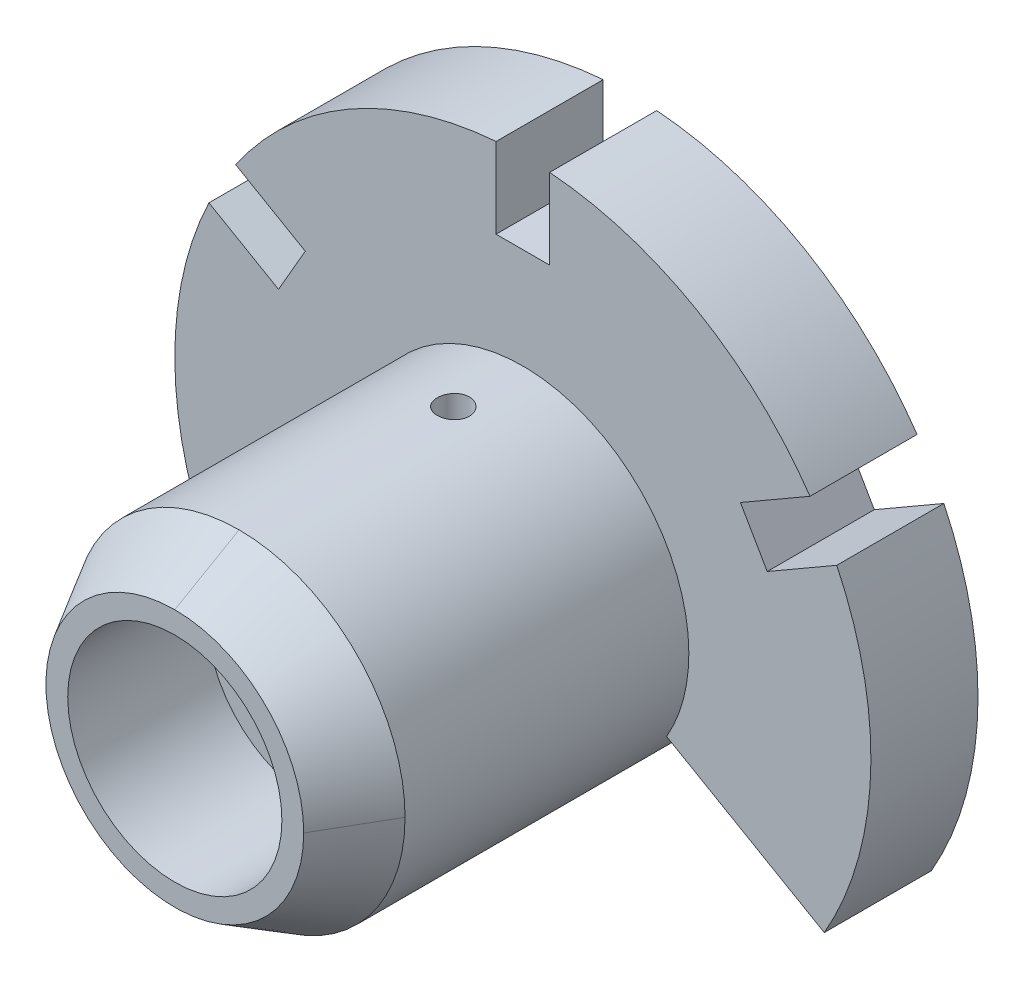
ISO-10303-21;
HEADER;
FILE_DESCRIPTION(('STEP AP214'),'2;1');
FILE_NAME('part.step','',(''),(''),'','','');
FILE_SCHEMA(('AUTOMOTIVE_DESIGN { 1 0 10303 214 1 1 1 1 }'));
ENDSEC;
DATA;
#1=APPLICATION_CONTEXT('core data for automotive mechanical design processes');
#2=APPLICATION_PROTOCOL_DEFINITION('international standard','automotive_design',2000,#1);
#3=PRODUCT_CONTEXT('',#1,'mechanical');
#4=PRODUCT('Part','Part','',(#3));
#5=PRODUCT_RELATED_PRODUCT_CATEGORY('part','',(#4));
#6=PRODUCT_DEFINITION_FORMATION('','',#4);
#7=PRODUCT_DEFINITION_CONTEXT('part definition',#1,'design');
#8=PRODUCT_DEFINITION('design','',#6,#7);
#9=PRODUCT_DEFINITION_SHAPE('','',#8);
#10=(LENGTH_UNIT() NAMED_UNIT(*) SI_UNIT(.MILLI.,.METRE.));
#11=(NAMED_UNIT(*) PLANE_ANGLE_UNIT() SI_UNIT($,.RADIAN.));
#12=(NAMED_UNIT(*) SI_UNIT($,.STERADIAN.) SOLID_ANGLE_UNIT());
#13=UNCERTAINTY_MEASURE_WITH_UNIT(LENGTH_MEASURE(1.E-05),#10,'distance_accuracy_value','');
#14=(GEOMETRIC_REPRESENTATION_CONTEXT(3) GLOBAL_UNCERTAINTY_ASSIGNED_CONTEXT((#13)) GLOBAL_UNIT_ASSIGNED_CONTEXT((#10,
#11,#12)) REPRESENTATION_CONTEXT('',''));
#15=CARTESIAN_POINT('',(0.,0.,0.));
#16=DIRECTION('',(0.,0.,1.));
#17=DIRECTION('',(1.,0.,0.));
#18=AXIS2_PLACEMENT_3D('',#15,#16,#17);
#19=CARTESIAN_POINT('',(0.,0.,0.));
#20=DIRECTION('',(0.,0.,1.));
#21=DIRECTION('',(1.,0.,0.));
#22=AXIS2_PLACEMENT_3D('',#19,#20,#21);
#23=CYLINDRICAL_SURFACE('',#22,12.5);
#24=CARTESIAN_POINT('',(0.,0.,0.));
#25=DIRECTION('',(0.,0.,1.));
#26=DIRECTION('',(1.,0.,0.));
#27=AXIS2_PLACEMENT_3D('',#24,#25,#26);
#28=CIRCLE('',#27,12.5);
#29=CARTESIAN_POINT('',(12.5,0.,0.));
#30=VERTEX_POINT('',#29);
#31=EDGE_CURVE('E200',#30,#30,#28,.T.);
#32=ORIENTED_EDGE('',*,*,#31,.F.);
#33=EDGE_LOOP('',(#32));
#34=FACE_BOUND('',#33,.T.);
#35=CARTESIAN_POINT('',(0.,0.,59.));
#36=DIRECTION('',(0.,0.,1.));
#37=DIRECTION('',(1.,0.,0.));
#38=AXIS2_PLACEMENT_3D('',#35,#36,#37);
#39=CIRCLE('',#38,12.5);
#40=CARTESIAN_POINT('',(12.5,0.,59.));
#41=VERTEX_POINT('',#40);
#42=EDGE_CURVE('E193',#41,#41,#39,.F.);
#43=ORIENTED_EDGE('',*,*,#42,.F.);
#44=EDGE_LOOP('',(#43));
#45=FACE_BOUND('',#44,.T.);
#46=CARTESIAN_POINT('',(0.,12.5,30.));
#47=CARTESIAN_POINT('',(0.165963929028716,12.4999970714968,30.0000050240773));
#48=CARTESIAN_POINT('',(0.331985420928067,12.4966615634859,30.0138184102361));
#49=CARTESIAN_POINT('',(0.659284290971381,12.4836783946933,30.0686327395954));
#50=CARTESIAN_POINT('',(0.820558683214276,12.4740268462166,30.1096504279947));
#51=CARTESIAN_POINT('',(1.13358839471402,12.4494823208195,30.2174923345044));
#52=CARTESIAN_POINT('',(1.28535442324823,12.4345953702841,30.2842868898576));
#53=CARTESIAN_POINT('',(1.57552517879763,12.4011725442513,30.4416854364459));
#54=CARTESIAN_POINT('',(1.71392971475166,12.3826366165873,30.5322897680773));
#55=CARTESIAN_POINT('',(1.97609263393972,12.3435386014785,30.7365641783755));
#56=CARTESIAN_POINT('',(2.0995595210048,12.3229472454311,30.8506027810493));
#57=CARTESIAN_POINT('',(2.32581080811943,12.2822574370147,31.0977188690646));
#58=CARTESIAN_POINT('',(2.42859304624489,12.2621590363612,31.230798342041));
#59=CARTESIAN_POINT('',(2.61189993555015,12.224437969062,31.5144458330175));
#60=CARTESIAN_POINT('',(2.69210377047565,12.2068525815312,31.6652265837589));
#61=CARTESIAN_POINT('',(2.82591582947333,12.1765733412448,31.9786198351285));
#62=CARTESIAN_POINT('',(2.87952794169564,12.1638787734309,32.1412306020232));
#63=CARTESIAN_POINT('',(2.95765058108663,12.1451184675007,32.4704765732689));
#64=CARTESIAN_POINT('',(2.98268262400617,12.1389341034343,32.6369811215255));
#65=CARTESIAN_POINT('',(3.00455808879087,12.1335389605945,32.9719323796428));
#66=CARTESIAN_POINT('',(3.00140571682399,12.1343271412568,33.1403787959569));
#67=CARTESIAN_POINT('',(2.96741912081942,12.1426811387008,33.4704759660129));
#68=CARTESIAN_POINT('',(2.93720103400494,12.1500960921292,33.6321945651896));
#69=CARTESIAN_POINT('',(2.85092141637189,12.1706283738785,33.9481973166478));
#70=CARTESIAN_POINT('',(2.79485817372027,12.1837460799133,34.1024809757344));
#71=CARTESIAN_POINT('',(2.65794121231782,12.2143476734445,34.4009129780844));
#72=CARTESIAN_POINT('',(2.5768594824696,12.2318714325758,34.5449524529167));
#73=CARTESIAN_POINT('',(2.39236688956383,12.2692875046197,34.8176045007226));
#74=CARTESIAN_POINT('',(2.28895240342647,12.2891802016137,34.9462145652851));
#75=CARTESIAN_POINT('',(2.05951493908847,12.329732025739,35.1878935703187));
#76=CARTESIAN_POINT('',(1.93297064389908,12.3503975788014,35.3004670990622));
#77=CARTESIAN_POINT('',(1.66255592459692,12.3896951594929,35.5028847197464));
#78=CARTESIAN_POINT('',(1.51868504982141,12.4083271342049,35.5927282202926));
#79=CARTESIAN_POINT('',(1.21702847718581,12.4415394956922,35.7472972206128));
#80=CARTESIAN_POINT('',(1.05920278696054,12.4561077058019,35.8119474562378));
#81=CARTESIAN_POINT('',(0.734497606078678,12.4794620474154,35.9136650790486));
#82=CARTESIAN_POINT('',(0.567619713387664,12.4882491958651,35.9507373176268));
#83=CARTESIAN_POINT('',(0.233787399651667,12.4989027542709,35.995502064652));
#84=CARTESIAN_POINT('',(0.0669284805450099,12.5009282130753,36.0038698924616));
#85=CARTESIAN_POINT('',(-0.265804381586627,12.4982807419474,35.9928332331491));
#86=CARTESIAN_POINT('',(-0.431678404764951,12.4936083648176,35.9734310380128));
#87=CARTESIAN_POINT('',(-0.755422580108845,12.4781916395217,35.9079630214836));
#88=CARTESIAN_POINT('',(-0.913370579311302,12.4675301590363,35.8622608904262));
#89=CARTESIAN_POINT('',(-1.21935330013476,12.4413335015664,35.7459018083047));
#90=CARTESIAN_POINT('',(-1.3673870666415,12.4257978558334,35.6752424570219));
#91=CARTESIAN_POINT('',(-1.6520615099557,12.3911910149582,35.5096334064022));
#92=CARTESIAN_POINT('',(-1.78847176740355,12.3720653178033,35.4142992830756));
#93=CARTESIAN_POINT('',(-2.04359904096632,12.3324936406987,35.2025430709866));
#94=CARTESIAN_POINT('',(-2.16231325074336,12.3120474520734,35.0861176439192));
#95=CARTESIAN_POINT('',(-2.38142453789941,12.2715742142771,34.8323591687915));
#96=CARTESIAN_POINT('',(-2.4813497404737,12.2515669262668,34.6946148779179));
#97=CARTESIAN_POINT('',(-2.65666020824082,12.2147538797452,34.4039095721033));
#98=CARTESIAN_POINT('',(-2.7320465722335,12.1979479778962,34.2509492389065));
#99=CARTESIAN_POINT('',(-2.85558993518171,12.1696189519335,33.934987486456));
#100=CARTESIAN_POINT('',(-2.90390754385905,12.1580647463107,33.7720517965788));
#101=CARTESIAN_POINT('',(-2.97238380283979,12.1415072663683,33.4400538149793));
#102=CARTESIAN_POINT('',(-2.99254804274991,12.1365026916888,33.2709927462382));
#103=CARTESIAN_POINT('',(-3.00387066449353,12.1337046220624,32.9363292997194));
#104=CARTESIAN_POINT('',(-2.99578106592266,12.1357241633848,32.7707535036733));
#105=CARTESIAN_POINT('',(-2.95253345626268,12.1463176460425,32.4434002357763));
#106=CARTESIAN_POINT('',(-2.91737590900097,12.1548914750658,32.2816226988887));
#107=CARTESIAN_POINT('',(-2.82138591303537,12.1775274976748,31.9672024474518));
#108=CARTESIAN_POINT('',(-2.76068402045612,12.191561756094,31.8145177274163));
#109=CARTESIAN_POINT('',(-2.61543373580583,12.2235433612686,31.5213955861163));
#110=CARTESIAN_POINT('',(-2.53088229934855,12.2414912075257,31.3809597314137));
#111=CARTESIAN_POINT('',(-2.33793007708464,12.279819325529,31.1126629998805));
#112=CARTESIAN_POINT('',(-2.22900267979018,12.3002478697533,30.9851876769013));
#113=CARTESIAN_POINT('',(-1.99143074773237,12.3409359831145,30.7500800119481));
#114=CARTESIAN_POINT('',(-1.86278158874234,12.361195511444,30.6424523367898));
#115=CARTESIAN_POINT('',(-1.5868829988014,12.3996570299581,30.4483907404453));
#116=CARTESIAN_POINT('',(-1.43936414359402,12.4178200201219,30.362331594558));
#117=CARTESIAN_POINT('',(-1.13153622828568,12.4496380610582,30.2163704672521));
#118=CARTESIAN_POINT('',(-0.971236973691224,12.4632965272855,30.1564486566084));
#119=CARTESIAN_POINT('',(-0.675887025694768,12.4824059901497,30.0739613748622));
#120=CARTESIAN_POINT('',(-0.542312066268424,12.4889599449579,30.0462833842143));
#121=CARTESIAN_POINT('',(-0.27250422747825,12.4977580149525,30.0093012191481));
#122=CARTESIAN_POINT('',(-0.136271517915777,12.5000024045682,29.9999958747745));
#123=CARTESIAN_POINT('',(0.,12.5,30.));
#124=B_SPLINE_CURVE_WITH_KNOTS('',3,(#46,#47,#48,#49,#50,#51,#52,#53,#54,#55,#56,#57,#58,#59,
#60,#61,#62,#63,#64,#65,#66,#67,#68,#69,#70,#71,#72,#73,#74,#75,#76,#77,#78,#79,#80,#81,#82,#83,
#84,#85,#86,#87,#88,#89,#90,#91,#92,#93,#94,#95,#96,#97,#98,#99,#100,#101,#102,#103,#104,#105,
#106,#107,#108,#109,#110,#111,#112,#113,#114,#115,#116,#117,#118,#119,#120,#121,#122,#123),
.UNSPECIFIED.,.T.,.F.,(4,2,2,2,2,2,2,2,2,2,2,2,2,2,2,2,2,2,2,2,2,2,2,2,2,2,2,2,2,2,2,2,2,2,2,2,
2,2,4),(0.,0.497392599366679,0.995091645758825,1.49221966408501,1.98935478998519,
2.49500570148357,3.00070943533306,3.51327262050849,4.02576083835038,4.52873995359111,
5.03164400680466,5.52338274964838,6.01515406709138,6.51154667521171,7.00801987450003,
7.51749958381935,8.02699254752171,8.53799614678203,9.04890983140415,9.54771776810826,
10.0464845383097,10.5385143736981,11.0305915421211,11.5308523313794,12.031192370573,
12.5427824523192,13.0543496229378,13.5628484119093,14.0712462285018,14.5662165454702,
15.0611783809799,15.5536406351284,16.0461657803879,16.5505844610431,17.0551215958269,
17.5678974206352,18.0802835459069,18.4887142303991,18.897118905514),.UNSPECIFIED.);
#125=CARTESIAN_POINT('',(0.,12.5,30.));
#126=VERTEX_POINT('',#125);
#127=EDGE_CURVE('E380',#126,#126,#124,.T.);
#128=ORIENTED_EDGE('',*,*,#127,.F.);
#129=EDGE_LOOP('',(#128));
#130=FACE_BOUND('',#129,.T.);
#131=ADVANCED_FACE('F41',(#34,#45,#130),#23,.F.);
#132=CARTESIAN_POINT('',(0.,0.,0.));
#133=DIRECTION('',(0.,0.,1.));
#134=DIRECTION('',(1.,0.,0.));
#135=AXIS2_PLACEMENT_3D('',#132,#133,#134);
#136=CYLINDRICAL_SURFACE('',#135,31.);
#137=CARTESIAN_POINT('',(0.,0.,73.));
#138=DIRECTION('',(0.,0.,-1.));
#139=DIRECTION('',(1.,0.,0.));
#140=AXIS2_PLACEMENT_3D('',#137,#138,#139);
#141=CIRCLE('',#140,31.);
#142=CARTESIAN_POINT('',(31.,0.,73.));
#143=VERTEX_POINT('',#142);
#144=CARTESIAN_POINT('',(0.,31.,73.));
#145=VERTEX_POINT('',#144);
#146=EDGE_CURVE('E170',#143,#145,#141,.T.);
#147=ORIENTED_EDGE('',*,*,#146,.T.);
#148=CARTESIAN_POINT('',(0.,0.,73.));
#149=DIRECTION('',(0.,0.,-1.));
#150=DIRECTION('',(0.,1.,0.));
#151=AXIS2_PLACEMENT_3D('',#148,#149,#150);
#152=CIRCLE('',#151,31.);
#153=EDGE_CURVE('E180',#145,#143,#152,.T.);
#154=ORIENTED_EDGE('',*,*,#153,.T.);
#155=EDGE_LOOP('',(#147,#154));
#156=FACE_BOUND('',#155,.T.);
#157=DIRECTION('',(0.,0.,1.));
#158=VECTOR('',#157,1.);
#159=CARTESIAN_POINT('',(26.8467875173176,-15.4999999999999,0.));
#160=LINE('',#159,#158);
#161=CARTESIAN_POINT('',(26.8467875173176,-15.4999999999999,20.));
#162=VERTEX_POINT('',#161);
#163=CARTESIAN_POINT('',(26.8467875173176,-15.4999999999999,0.));
#164=VERTEX_POINT('',#163);
#165=EDGE_CURVE('E214',#162,#164,#160,.F.);
#166=ORIENTED_EDGE('',*,*,#165,.F.);
#167=CARTESIAN_POINT('',(0.,0.,20.));
#168=DIRECTION('',(0.,0.,1.));
#169=DIRECTION('',(1.,0.,0.));
#170=AXIS2_PLACEMENT_3D('',#167,#168,#169);
#171=CIRCLE('',#170,31.);
#172=CARTESIAN_POINT('',(-26.8467875173176,-15.4999999999999,20.));
#173=VERTEX_POINT('',#172);
#174=EDGE_CURVE('E208',#162,#173,#171,.T.);
#175=ORIENTED_EDGE('',*,*,#174,.T.);
#176=DIRECTION('',(0.,0.,1.));
#177=VECTOR('',#176,1.);
#178=CARTESIAN_POINT('',(-26.8467875173176,-15.4999999999999,0.));
#179=LINE('',#178,#177);
#180=CARTESIAN_POINT('',(-26.8467875173176,-15.4999999999999,0.));
#181=VERTEX_POINT('',#180);
#182=EDGE_CURVE('E211',#173,#181,#179,.F.);
#183=ORIENTED_EDGE('',*,*,#182,.T.);
#184=CARTESIAN_POINT('',(0.,0.,0.));
#185=DIRECTION('',(0.,0.,1.));
#186=DIRECTION('',(1.,0.,0.));
#187=AXIS2_PLACEMENT_3D('',#184,#185,#186);
#188=CIRCLE('',#187,31.);
#189=EDGE_CURVE('E205',#181,#164,#188,.T.);
#190=ORIENTED_EDGE('',*,*,#189,.T.);
#191=EDGE_LOOP('',(#166,#175,#183,#190));
#192=FACE_BOUND('',#191,.T.);
#193=CARTESIAN_POINT('',(0.,31.,30.));
#194=CARTESIAN_POINT('',(0.16808953819396,30.9999981216868,30.0000072926713));
#195=CARTESIAN_POINT('',(0.336290893639732,30.9986183296534,30.0141746003681));
#196=CARTESIAN_POINT('',(0.668032360014184,30.9932467413095,30.0704779963018));
#197=CARTESIAN_POINT('',(0.831567095634698,30.9892520504391,30.1126450796107));
#198=CARTESIAN_POINT('',(1.1491232015134,30.9791016952434,30.223710689862));
#199=CARTESIAN_POINT('',(1.3031501789756,30.9729473191915,30.2925932833118));
#200=CARTESIAN_POINT('',(1.59742179410561,30.9591661779027,30.4551041523002));
#201=CARTESIAN_POINT('',(1.73766920753563,30.951539710126,30.5487274299855));
#202=CARTESIAN_POINT('',(2.00090903838761,30.9356401661369,30.7584021324513));
#203=CARTESIAN_POINT('',(2.12384834831157,30.9273652160721,30.8745200960667));
#204=CARTESIAN_POINT('',(2.34852587257413,30.9111168874028,31.1257463092444));
#205=CARTESIAN_POINT('',(2.4502631167817,30.9031435226114,31.2608554273009));
#206=CARTESIAN_POINT('',(2.62983510424632,30.8883818042451,31.5465590733066));
#207=CARTESIAN_POINT('',(2.70762204927907,30.8815958318763,31.697183777231));
#208=CARTESIAN_POINT('',(2.83678012663747,30.8700001357254,32.0094334566859));
#209=CARTESIAN_POINT('',(2.88815187276075,30.8651903660238,32.1710581765154));
#210=CARTESIAN_POINT('',(2.96286448602835,30.8581083751264,32.5001800490751));
#211=CARTESIAN_POINT('',(2.98629315240275,30.8558282073194,32.6676570970113));
#212=CARTESIAN_POINT('',(3.004725922064,30.8540388359978,33.0041806726224));
#213=CARTESIAN_POINT('',(2.99973072800294,30.8545295639853,33.1732271613968));
#214=CARTESIAN_POINT('',(2.96152997789402,30.8582192879785,33.5074865186794));
#215=CARTESIAN_POINT('',(2.92842019384616,30.8614090894947,33.6727104482114));
#216=CARTESIAN_POINT('',(2.83507910089501,30.8701231766115,33.9952451505818));
#217=CARTESIAN_POINT('',(2.7748474465782,30.8756474919435,34.1525558226117));
#218=CARTESIAN_POINT('',(2.62886634023895,30.8884187378213,34.4551016302242));
#219=CARTESIAN_POINT('',(2.54307429832064,30.895668539364,34.6003160896787));
#220=CARTESIAN_POINT('',(2.34843836166378,30.9110714160826,34.8743211427964));
#221=CARTESIAN_POINT('',(2.23959383532138,30.9192245160047,35.0031112863028));
#222=CARTESIAN_POINT('',(2.00140724966772,30.9355562996981,35.2411684252305));
#223=CARTESIAN_POINT('',(1.87198246168808,30.9437349502123,35.3503526663892));
#224=CARTESIAN_POINT('',(1.59659679423303,30.9591644807365,35.5454575776251));
#225=CARTESIAN_POINT('',(1.4506358979559,30.9664153598039,35.6313782240647));
#226=CARTESIAN_POINT('',(1.14626470800904,30.9791745335425,35.777513274488));
#227=CARTESIAN_POINT('',(0.987852439296271,30.984682551061,35.8377235905031));
#228=CARTESIAN_POINT('',(0.663101793767337,30.9933325036748,35.9306687436254));
#229=CARTESIAN_POINT('',(0.496763639032332,30.9964745050237,35.9634043500886));
#230=CARTESIAN_POINT('',(0.161599739931645,31.0000298977498,36.0003661115517));
#231=CARTESIAN_POINT('',(-0.00721329744838298,31.0004542206361,36.0047064842122));
#232=CARTESIAN_POINT('',(-0.34316444686552,30.9985557346558,35.9850543988535));
#233=CARTESIAN_POINT('',(-0.510302580043938,30.9962329605082,35.9610622989136));
#234=CARTESIAN_POINT('',(-0.837830646880853,30.9891083456253,35.885521054054));
#235=CARTESIAN_POINT('',(-0.998233002571721,30.9843113065313,35.834025276846));
#236=CARTESIAN_POINT('',(-1.30812213033292,30.9727764720913,35.7049932283578));
#237=CARTESIAN_POINT('',(-1.45760867236246,30.9660386358595,35.6274564084791));
#238=CARTESIAN_POINT('',(-1.7419399139047,30.9513489804652,35.4482592182569));
#239=CARTESIAN_POINT('',(-1.87673703972383,30.9433934064725,35.3465236756985));
#240=CARTESIAN_POINT('',(-2.12738176682207,30.9271733648177,35.1219248898692));
#241=CARTESIAN_POINT('',(-2.24322892299976,30.9189088899057,34.9990611504731));
#242=CARTESIAN_POINT('',(-2.45308082086947,30.9029697222484,34.7351958174356));
#243=CARTESIAN_POINT('',(-2.54701068944993,30.8952971094589,34.5941345339742));
#244=CARTESIAN_POINT('',(-2.70984725368369,30.8814415920736,34.2981732929595));
#245=CARTESIAN_POINT('',(-2.77875427265655,30.8752586682299,34.1432735142454));
#246=CARTESIAN_POINT('',(-2.88946331848758,30.8650953093356,33.824290822766));
#247=CARTESIAN_POINT('',(-2.93131016097981,30.8611112342798,33.6602235848962));
#248=CARTESIAN_POINT('',(-2.98685649184875,30.8557851841355,33.3273509537787));
#249=CARTESIAN_POINT('',(-3.00055673174161,30.8544431385049,33.1585456871586));
#250=CARTESIAN_POINT('',(-2.99941089677632,30.8545544912674,32.8217329177514));
#251=CARTESIAN_POINT('',(-2.98468244202973,30.8559963715282,32.6537249986032));
#252=CARTESIAN_POINT('',(-2.92734363942155,30.8614885711948,32.3225818773394));
#253=CARTESIAN_POINT('',(-2.88473325762495,30.8655388937753,32.1594466811547));
#254=CARTESIAN_POINT('',(-2.77287207296849,30.8757884480354,31.8426789676018));
#255=CARTESIAN_POINT('',(-2.70362445425821,30.8819874228617,31.6890453169893));
#256=CARTESIAN_POINT('',(-2.5404667821681,30.8958363260255,31.3955632677754));
#257=CARTESIAN_POINT('',(-2.44655691826962,30.9034862432152,31.2557147632734));
#258=CARTESIAN_POINT('',(-2.23629854709217,30.9194129497018,30.9931700503403));
#259=CARTESIAN_POINT('',(-2.11986246702146,30.9276921063672,30.8705441166544));
#260=CARTESIAN_POINT('',(-1.86802794095432,30.9439227915658,30.6465182199721));
#261=CARTESIAN_POINT('',(-1.7326249503521,30.9518742409853,30.54512335866));
#262=CARTESIAN_POINT('',(-1.44635100828488,30.9665730255592,30.3662508870881));
#263=CARTESIAN_POINT('',(-1.29544401960985,30.9733174506824,30.2888307584908));
#264=CARTESIAN_POINT('',(-0.982804571537972,30.984810213023,30.1605311283933));
#265=CARTESIAN_POINT('',(-0.821084602869863,30.9895608087819,30.1096215807844));
#266=CARTESIAN_POINT('',(-0.548700807348903,30.9953315866936,30.0485391227234));
#267=CARTESIAN_POINT('',(-0.439780465789539,30.9970741185407,30.030361680573));
#268=CARTESIAN_POINT('',(-0.220589467546875,30.9994089393846,30.0060897490584));
#269=CARTESIAN_POINT('',(-0.110318815999825,31.0000012327554,29.9999952137481));
#270=CARTESIAN_POINT('',(0.,31.,30.));
#271=B_SPLINE_CURVE_WITH_KNOTS('',3,(#193,#194,#195,#196,#197,#198,#199,#200,#201,#202,#203,
#204,#205,#206,#207,#208,#209,#210,#211,#212,#213,#214,#215,#216,#217,#218,#219,#220,#221,#222,
#223,#224,#225,#226,#227,#228,#229,#230,#231,#232,#233,#234,#235,#236,#237,#238,#239,#240,#241,
#242,#243,#244,#245,#246,#247,#248,#249,#250,#251,#252,#253,#254,#255,#256,#257,#258,#259,#260,
#261,#262,#263,#264,#265,#266,#267,#268,#269,#270),.UNSPECIFIED.,.T.,.F.,(4,2,2,2,2,2,2,2,2,2,2,
2,2,2,2,2,2,2,2,2,2,2,2,2,2,2,2,2,2,2,2,2,2,2,2,2,2,2,4),(0.,0.503865783837313,1.00829026678701,
1.51241436562501,2.01643670435002,2.5219733460598,3.02753311424981,3.53409539715722,
4.04064590878196,4.54560057243948,5.0505427534186,5.55377172395107,6.05700710359209,
6.56108573191771,7.06517817303649,7.57135072598204,8.07752379323573,8.58377731257894,
9.09001665516903,9.59421843000421,10.0984138325665,10.6016344376436,11.1048656445763,
11.6096810161169,12.1145082431801,12.6210355890123,13.1275563897857,13.6332361544347,
14.1389024172251,14.6424810339147,15.1460602635093,15.6495793151824,16.153094498405,
16.6586079749665,17.164242783978,17.671080677736,18.1773428831038,18.5080362068125,
18.838728273035),.UNSPECIFIED.);
#272=CARTESIAN_POINT('',(0.,31.,30.));
#273=VERTEX_POINT('',#272);
#274=EDGE_CURVE('E45',#273,#273,#271,.T.);
#275=ORIENTED_EDGE('',*,*,#274,.T.);
#276=EDGE_LOOP('',(#275));
#277=FACE_BOUND('',#276,.T.);
#278=ADVANCED_FACE('F186',(#156,#192,#277),#136,.T.);
#279=CARTESIAN_POINT('',(0.,0.,20.));
#280=DIRECTION('',(0.499999999999998,0.86602540378444,0.));
#281=DIRECTION('',(-0.86602540378444,0.499999999999998,0.));
#282=AXIS2_PLACEMENT_3D('',#279,#280,#281);
#283=PLANE('',#282);
#284=DIRECTION('',(0.86602540378444,-0.499999999999998,0.));
#285=VECTOR('',#284,1.);
#286=CARTESIAN_POINT('',(0.,0.,20.));
#287=LINE('',#286,#285);
#288=CARTESIAN_POINT('',(56.2916512459883,-32.4999999999997,20.));
#289=VERTEX_POINT('',#288);
#290=EDGE_CURVE('E219',#162,#289,#287,.T.);
#291=ORIENTED_EDGE('',*,*,#290,.F.);
#292=ORIENTED_EDGE('',*,*,#165,.T.);
#293=DIRECTION('',(0.86602540378444,-0.499999999999998,0.));
#294=VECTOR('',#293,1.);
#295=CARTESIAN_POINT('',(0.,0.,0.));
#296=LINE('',#295,#294);
#297=CARTESIAN_POINT('',(56.2916512459883,-32.4999999999997,0.));
#298=VERTEX_POINT('',#297);
#299=EDGE_CURVE('E218',#164,#298,#296,.T.);
#300=ORIENTED_EDGE('',*,*,#299,.T.);
#301=DIRECTION('',(0.,0.,-1.));
#302=VECTOR('',#301,1.);
#303=CARTESIAN_POINT('',(56.2916512459883,-32.4999999999997,20.));
#304=LINE('',#303,#302);
#305=EDGE_CURVE('E11',#289,#298,#304,.T.);
#306=ORIENTED_EDGE('',*,*,#305,.F.);
#307=EDGE_LOOP('',(#291,#292,#300,#306));
#308=FACE_BOUND('',#307,.T.);
#309=ADVANCED_FACE('F43',(#308),#283,.F.);
#310=CARTESIAN_POINT('',(0.,0.,20.));
#311=DIRECTION('',(0.,0.,-1.));
#312=DIRECTION('',(-1.,0.,0.));
#313=AXIS2_PLACEMENT_3D('',#310,#311,#312);
#314=CYLINDRICAL_SURFACE('',#313,64.9999999999998);
#315=CARTESIAN_POINT('',(0.,0.,0.));
#316=DIRECTION('',(0.,0.,1.));
#317=DIRECTION('',(1.,0.,0.));
#318=AXIS2_PLACEMENT_3D('',#315,#316,#317);
#319=CIRCLE('',#318,64.9999999999998);
#320=CARTESIAN_POINT('',(58.6248608016092,28.073576473117,0.));
#321=VERTEX_POINT('',#320);
#322=EDGE_CURVE('E278',#298,#321,#319,.T.);
#323=ORIENTED_EDGE('',*,*,#322,.T.);
#324=DIRECTION('',(0.,0.,-1.));
#325=VECTOR('',#324,1.);
#326=CARTESIAN_POINT('',(58.6248608016092,28.073576473117,20.));
#327=LINE('',#326,#325);
#328=CARTESIAN_POINT('',(58.6248608016092,28.073576473117,20.));
#329=VERTEX_POINT('',#328);
#330=EDGE_CURVE('E56',#329,#321,#327,.T.);
#331=ORIENTED_EDGE('',*,*,#330,.F.);
#332=CARTESIAN_POINT('',(0.,0.,20.));
#333=DIRECTION('',(0.,0.,1.));
#334=DIRECTION('',(1.,0.,0.));
#335=AXIS2_PLACEMENT_3D('',#332,#333,#334);
#336=CIRCLE('',#335,64.9999999999998);
#337=EDGE_CURVE('E222',#289,#329,#336,.T.);
#338=ORIENTED_EDGE('',*,*,#337,.F.);
#339=ORIENTED_EDGE('',*,*,#305,.T.);
#340=EDGE_LOOP('',(#323,#331,#338,#339));
#341=FACE_BOUND('',#340,.T.);
#342=ADVANCED_FACE('F432',(#341),#314,.T.);
#343=CARTESIAN_POINT('',(2.49999999999999,-4.3301270189222,20.));
#344=DIRECTION('',(-0.499999999999998,0.86602540378444,0.));
#345=DIRECTION('',(-0.86602540378444,-0.499999999999998,0.));
#346=AXIS2_PLACEMENT_3D('',#343,#344,#345);
#347=PLANE('',#346);
#348=DIRECTION('',(0.86602540378444,0.499999999999998,0.));
#349=VECTOR('',#348,1.);
#350=CARTESIAN_POINT('',(2.49999999999999,-4.3301270189222,0.));
#351=LINE('',#350,#349);
#352=CARTESIAN_POINT('',(45.6344797448426,20.573576473117,0.));
#353=VERTEX_POINT('',#352);
#354=EDGE_CURVE('E282',#353,#321,#351,.T.);
#355=ORIENTED_EDGE('',*,*,#354,.F.);
#356=DIRECTION('',(0.,0.,-1.));
#357=VECTOR('',#356,1.);
#358=CARTESIAN_POINT('',(45.6344797448426,20.573576473117,20.));
#359=LINE('',#358,#357);
#360=CARTESIAN_POINT('',(45.6344797448426,20.573576473117,20.));
#361=VERTEX_POINT('',#360);
#362=EDGE_CURVE('E365',#361,#353,#359,.T.);
#363=ORIENTED_EDGE('',*,*,#362,.F.);
#364=DIRECTION('',(0.86602540378444,0.499999999999998,0.));
#365=VECTOR('',#364,1.);
#366=CARTESIAN_POINT('',(2.49999999999999,-4.3301270189222,20.));
#367=LINE('',#366,#365);
#368=EDGE_CURVE('E226',#361,#329,#367,.T.);
#369=ORIENTED_EDGE('',*,*,#368,.T.);
#370=ORIENTED_EDGE('',*,*,#330,.T.);
#371=EDGE_LOOP('',(#355,#363,#369,#370));
#372=FACE_BOUND('',#371,.T.);
#373=ADVANCED_FACE('F486',(#372),#347,.T.);
#374=CARTESIAN_POINT('',(43.1344797448426,24.9037034920392,20.));
#375=DIRECTION('',(0.86602540378444,0.499999999999998,0.));
#376=DIRECTION('',(-0.499999999999998,0.86602540378444,0.));
#377=AXIS2_PLACEMENT_3D('',#374,#375,#376);
#378=PLANE('',#377);
#379=DIRECTION('',(0.499999999999998,-0.86602540378444,0.));
#380=VECTOR('',#379,1.);
#381=CARTESIAN_POINT('',(43.1344797448426,24.9037034920392,0.));
#382=LINE('',#381,#380);
#383=CARTESIAN_POINT('',(40.6344797448426,29.2338305109614,0.));
#384=VERTEX_POINT('',#383);
#385=EDGE_CURVE('E286',#384,#353,#382,.T.);
#386=ORIENTED_EDGE('',*,*,#385,.F.);
#387=DIRECTION('',(0.,0.,-1.));
#388=VECTOR('',#387,1.);
#389=CARTESIAN_POINT('',(40.6344797448426,29.2338305109614,20.));
#390=LINE('',#389,#388);
#391=CARTESIAN_POINT('',(40.6344797448426,29.2338305109614,20.));
#392=VERTEX_POINT('',#391);
#393=EDGE_CURVE('E362',#392,#384,#390,.T.);
#394=ORIENTED_EDGE('',*,*,#393,.F.);
#395=DIRECTION('',(0.499999999999998,-0.86602540378444,0.));
#396=VECTOR('',#395,1.);
#397=CARTESIAN_POINT('',(43.1344797448426,24.9037034920392,20.));
#398=LINE('',#397,#396);
#399=EDGE_CURVE('E230',#392,#361,#398,.T.);
#400=ORIENTED_EDGE('',*,*,#399,.T.);
#401=ORIENTED_EDGE('',*,*,#362,.T.);
#402=EDGE_LOOP('',(#386,#394,#400,#401));
#403=FACE_BOUND('',#402,.T.);
#404=ADVANCED_FACE('F482',(#403),#378,.T.);
#405=CARTESIAN_POINT('',(-2.49999999999998,4.33012701892218,20.));
#406=DIRECTION('',(0.499999999999998,-0.86602540378444,0.));
#407=DIRECTION('',(0.86602540378444,0.499999999999998,0.));
#408=AXIS2_PLACEMENT_3D('',#405,#406,#407);
#409=PLANE('',#408);
#410=DIRECTION('',(-0.86602540378444,-0.499999999999998,0.));
#411=VECTOR('',#410,1.);
#412=CARTESIAN_POINT('',(-2.49999999999998,4.33012701892218,0.));
#413=LINE('',#412,#411);
#414=CARTESIAN_POINT('',(53.6248608016092,36.7338305109614,0.));
#415=VERTEX_POINT('',#414);
#416=EDGE_CURVE('E290',#415,#384,#413,.T.);
#417=ORIENTED_EDGE('',*,*,#416,.F.);
#418=DIRECTION('',(0.,0.,-1.));
#419=VECTOR('',#418,1.);
#420=CARTESIAN_POINT('',(53.6248608016092,36.7338305109614,20.));
#421=LINE('',#420,#419);
#422=CARTESIAN_POINT('',(53.6248608016092,36.7338305109614,20.));
#423=VERTEX_POINT('',#422);
#424=EDGE_CURVE('E359',#423,#415,#421,.T.);
#425=ORIENTED_EDGE('',*,*,#424,.F.);
#426=DIRECTION('',(-0.86602540378444,-0.499999999999998,0.));
#427=VECTOR('',#426,1.);
#428=CARTESIAN_POINT('',(-2.49999999999998,4.33012701892218,20.));
#429=LINE('',#428,#427);
#430=EDGE_CURVE('E234',#423,#392,#429,.T.);
#431=ORIENTED_EDGE('',*,*,#430,.T.);
#432=ORIENTED_EDGE('',*,*,#393,.T.);
#433=EDGE_LOOP('',(#417,#425,#431,#432));
#434=FACE_BOUND('',#433,.T.);
#435=ADVANCED_FACE('F478',(#434),#409,.T.);
#436=CARTESIAN_POINT('',(0.,0.,20.));
#437=DIRECTION('',(0.,0.,-1.));
#438=DIRECTION('',(-1.,0.,0.));
#439=AXIS2_PLACEMENT_3D('',#436,#437,#438);
#440=CYLINDRICAL_SURFACE('',#439,65.);
#441=CARTESIAN_POINT('',(0.,0.,0.));
#442=DIRECTION('',(0.,0.,1.));
#443=DIRECTION('',(1.,0.,0.));
#444=AXIS2_PLACEMENT_3D('',#441,#442,#443);
#445=CIRCLE('',#444,65.);
#446=CARTESIAN_POINT('',(5.,64.8074069840786,0.));
#447=VERTEX_POINT('',#446);
#448=EDGE_CURVE('E294',#415,#447,#445,.T.);
#449=ORIENTED_EDGE('',*,*,#448,.T.);
#450=DIRECTION('',(0.,0.,-1.));
#451=VECTOR('',#450,1.);
#452=CARTESIAN_POINT('',(5.,64.8074069840786,20.));
#453=LINE('',#452,#451);
#454=CARTESIAN_POINT('',(5.,64.8074069840786,20.));
#455=VERTEX_POINT('',#454);
#456=EDGE_CURVE('E356',#455,#447,#453,.T.);
#457=ORIENTED_EDGE('',*,*,#456,.F.);
#458=CARTESIAN_POINT('',(0.,0.,20.));
#459=DIRECTION('',(0.,0.,1.));
#460=DIRECTION('',(1.,0.,0.));
#461=AXIS2_PLACEMENT_3D('',#458,#459,#460);
#462=CIRCLE('',#461,65.);
#463=EDGE_CURVE('E238',#423,#455,#462,.T.);
#464=ORIENTED_EDGE('',*,*,#463,.F.);
#465=ORIENTED_EDGE('',*,*,#424,.T.);
#466=EDGE_LOOP('',(#449,#457,#464,#465));
#467=FACE_BOUND('',#466,.T.);
#468=ADVANCED_FACE('F474',(#467),#440,.T.);
#469=CARTESIAN_POINT('',(5.00000000000001,0.,20.));
#470=DIRECTION('',(-1.,0.,0.));
#471=DIRECTION('',(0.,-1.,0.));
#472=AXIS2_PLACEMENT_3D('',#469,#470,#471);
#473=PLANE('',#472);
#474=DIRECTION('',(0.,1.,0.));
#475=VECTOR('',#474,1.);
#476=CARTESIAN_POINT('',(5.00000000000001,0.,0.));
#477=LINE('',#476,#475);
#478=CARTESIAN_POINT('',(5.,49.8074069840786,0.));
#479=VERTEX_POINT('',#478);
#480=EDGE_CURVE('E298',#479,#447,#477,.T.);
#481=ORIENTED_EDGE('',*,*,#480,.F.);
#482=DIRECTION('',(0.,0.,-1.));
#483=VECTOR('',#482,1.);
#484=CARTESIAN_POINT('',(5.,49.8074069840786,20.));
#485=LINE('',#484,#483);
#486=CARTESIAN_POINT('',(5.,49.8074069840786,20.));
#487=VERTEX_POINT('',#486);
#488=EDGE_CURVE('E353',#487,#479,#485,.T.);
#489=ORIENTED_EDGE('',*,*,#488,.F.);
#490=DIRECTION('',(0.,1.,0.));
#491=VECTOR('',#490,1.);
#492=CARTESIAN_POINT('',(5.00000000000001,0.,20.));
#493=LINE('',#492,#491);
#494=EDGE_CURVE('E241',#487,#455,#493,.T.);
#495=ORIENTED_EDGE('',*,*,#494,.T.);
#496=ORIENTED_EDGE('',*,*,#456,.T.);
#497=EDGE_LOOP('',(#481,#489,#495,#496));
#498=FACE_BOUND('',#497,.T.);
#499=ADVANCED_FACE('F470',(#498),#473,.T.);
#500=CARTESIAN_POINT('',(0.,49.8074069840786,20.));
#501=DIRECTION('',(0.,1.,0.));
#502=DIRECTION('',(0.,0.,1.));
#503=AXIS2_PLACEMENT_3D('',#500,#501,#502);
#504=PLANE('',#503);
#505=DIRECTION('',(1.,0.,0.));
#506=VECTOR('',#505,1.);
#507=CARTESIAN_POINT('',(0.,49.8074069840786,0.));
#508=LINE('',#507,#506);
#509=CARTESIAN_POINT('',(-5.,49.8074069840786,0.));
#510=VERTEX_POINT('',#509);
#511=EDGE_CURVE('E302',#510,#479,#508,.T.);
#512=ORIENTED_EDGE('',*,*,#511,.F.);
#513=DIRECTION('',(0.,0.,-1.));
#514=VECTOR('',#513,1.);
#515=CARTESIAN_POINT('',(-5.,49.8074069840786,20.));
#516=LINE('',#515,#514);
#517=CARTESIAN_POINT('',(-5.,49.8074069840786,20.));
#518=VERTEX_POINT('',#517);
#519=EDGE_CURVE('E350',#518,#510,#516,.T.);
#520=ORIENTED_EDGE('',*,*,#519,.F.);
#521=DIRECTION('',(1.,0.,0.));
#522=VECTOR('',#521,1.);
#523=CARTESIAN_POINT('',(0.,49.8074069840786,20.));
#524=LINE('',#523,#522);
#525=EDGE_CURVE('E245',#518,#487,#524,.T.);
#526=ORIENTED_EDGE('',*,*,#525,.T.);
#527=ORIENTED_EDGE('',*,*,#488,.T.);
#528=EDGE_LOOP('',(#512,#520,#526,#527));
#529=FACE_BOUND('',#528,.T.);
#530=ADVANCED_FACE('F466',(#529),#504,.T.);
#531=CARTESIAN_POINT('',(-4.99999999999999,0.,20.));
#532=DIRECTION('',(1.,0.,0.));
#533=DIRECTION('',(0.,1.,0.));
#534=AXIS2_PLACEMENT_3D('',#531,#532,#533);
#535=PLANE('',#534);
#536=DIRECTION('',(0.,-1.,0.));
#537=VECTOR('',#536,1.);
#538=CARTESIAN_POINT('',(-4.99999999999999,0.,0.));
#539=LINE('',#538,#537);
#540=CARTESIAN_POINT('',(-5.,64.8074069840786,0.));
#541=VERTEX_POINT('',#540);
#542=EDGE_CURVE('E306',#541,#510,#539,.T.);
#543=ORIENTED_EDGE('',*,*,#542,.F.);
#544=DIRECTION('',(0.,0.,-1.));
#545=VECTOR('',#544,1.);
#546=CARTESIAN_POINT('',(-5.,64.8074069840786,20.));
#547=LINE('',#546,#545);
#548=CARTESIAN_POINT('',(-5.,64.8074069840786,20.));
#549=VERTEX_POINT('',#548);
#550=EDGE_CURVE('E347',#549,#541,#547,.T.);
#551=ORIENTED_EDGE('',*,*,#550,.F.);
#552=DIRECTION('',(0.,-1.,0.));
#553=VECTOR('',#552,1.);
#554=CARTESIAN_POINT('',(-4.99999999999999,0.,20.));
#555=LINE('',#554,#553);
#556=EDGE_CURVE('E249',#549,#518,#555,.T.);
#557=ORIENTED_EDGE('',*,*,#556,.T.);
#558=ORIENTED_EDGE('',*,*,#519,.T.);
#559=EDGE_LOOP('',(#543,#551,#557,#558));
#560=FACE_BOUND('',#559,.T.);
#561=ADVANCED_FACE('F462',(#560),#535,.T.);
#562=CARTESIAN_POINT('',(0.,0.,20.));
#563=DIRECTION('',(0.,0.,-1.));
#564=DIRECTION('',(-1.,0.,0.));
#565=AXIS2_PLACEMENT_3D('',#562,#563,#564);
#566=CYLINDRICAL_SURFACE('',#565,65.);
#567=CARTESIAN_POINT('',(0.,0.,0.));
#568=DIRECTION('',(0.,0.,1.));
#569=DIRECTION('',(1.,0.,0.));
#570=AXIS2_PLACEMENT_3D('',#567,#568,#569);
#571=CIRCLE('',#570,65.);
#572=CARTESIAN_POINT('',(-53.6248608016087,36.7338305109621,0.));
#573=VERTEX_POINT('',#572);
#574=EDGE_CURVE('E310',#541,#573,#571,.T.);
#575=ORIENTED_EDGE('',*,*,#574,.T.);
#576=DIRECTION('',(0.,0.,-1.));
#577=VECTOR('',#576,1.);
#578=CARTESIAN_POINT('',(-53.6248608016087,36.7338305109621,20.));
#579=LINE('',#578,#577);
#580=CARTESIAN_POINT('',(-53.6248608016087,36.7338305109621,20.));
#581=VERTEX_POINT('',#580);
#582=EDGE_CURVE('E344',#581,#573,#579,.T.);
#583=ORIENTED_EDGE('',*,*,#582,.F.);
#584=CARTESIAN_POINT('',(0.,0.,20.));
#585=DIRECTION('',(0.,0.,1.));
#586=DIRECTION('',(1.,0.,0.));
#587=AXIS2_PLACEMENT_3D('',#584,#585,#586);
#588=CIRCLE('',#587,65.);
#589=EDGE_CURVE('E253',#549,#581,#588,.T.);
#590=ORIENTED_EDGE('',*,*,#589,.F.);
#591=ORIENTED_EDGE('',*,*,#550,.T.);
#592=EDGE_LOOP('',(#575,#583,#590,#591));
#593=FACE_BOUND('',#592,.T.);
#594=ADVANCED_FACE('F458',(#593),#566,.T.);
#595=CARTESIAN_POINT('',(2.50000000000005,4.33012701892217,20.));
#596=DIRECTION('',(-0.50000000000001,-0.866025403784433,0.));
#597=DIRECTION('',(0.866025403784433,-0.50000000000001,0.));
#598=AXIS2_PLACEMENT_3D('',#595,#596,#597);
#599=PLANE('',#598);
#600=DIRECTION('',(-0.866025403784433,0.50000000000001,0.));
#601=VECTOR('',#600,1.);
#602=CARTESIAN_POINT('',(2.50000000000005,4.33012701892217,0.));
#603=LINE('',#602,#601);
#604=CARTESIAN_POINT('',(-40.6344797448422,29.233830510962,0.));
#605=VERTEX_POINT('',#604);
#606=EDGE_CURVE('E314',#605,#573,#603,.T.);
#607=ORIENTED_EDGE('',*,*,#606,.F.);
#608=DIRECTION('',(0.,0.,-1.));
#609=VECTOR('',#608,1.);
#610=CARTESIAN_POINT('',(-40.6344797448422,29.233830510962,20.));
#611=LINE('',#610,#609);
#612=CARTESIAN_POINT('',(-40.6344797448422,29.233830510962,20.));
#613=VERTEX_POINT('',#612);
#614=EDGE_CURVE('E341',#613,#605,#611,.T.);
#615=ORIENTED_EDGE('',*,*,#614,.F.);
#616=DIRECTION('',(-0.866025403784433,0.50000000000001,0.));
#617=VECTOR('',#616,1.);
#618=CARTESIAN_POINT('',(2.50000000000005,4.33012701892217,20.));
#619=LINE('',#618,#617);
#620=EDGE_CURVE('E256',#613,#581,#619,.T.);
#621=ORIENTED_EDGE('',*,*,#620,.T.);
#622=ORIENTED_EDGE('',*,*,#582,.T.);
#623=EDGE_LOOP('',(#607,#615,#621,#622));
#624=FACE_BOUND('',#623,.T.);
#625=ADVANCED_FACE('F454',(#624),#599,.T.);
#626=CARTESIAN_POINT('',(-43.1344797448423,24.9037034920398,20.));
#627=DIRECTION('',(-0.866025403784433,0.50000000000001,0.));
#628=DIRECTION('',(-0.50000000000001,-0.866025403784433,0.));
#629=AXIS2_PLACEMENT_3D('',#626,#627,#628);
#630=PLANE('',#629);
#631=DIRECTION('',(0.50000000000001,0.866025403784433,0.));
#632=VECTOR('',#631,1.);
#633=CARTESIAN_POINT('',(-43.1344797448423,24.9037034920398,0.));
#634=LINE('',#633,#632);
#635=CARTESIAN_POINT('',(-45.6344797448423,20.5735764731176,0.));
#636=VERTEX_POINT('',#635);
#637=EDGE_CURVE('E318',#636,#605,#634,.T.);
#638=ORIENTED_EDGE('',*,*,#637,.F.);
#639=DIRECTION('',(0.,0.,-1.));
#640=VECTOR('',#639,1.);
#641=CARTESIAN_POINT('',(-45.6344797448423,20.5735764731176,20.));
#642=LINE('',#641,#640);
#643=CARTESIAN_POINT('',(-45.6344797448423,20.5735764731176,20.));
#644=VERTEX_POINT('',#643);
#645=EDGE_CURVE('E338',#644,#636,#642,.T.);
#646=ORIENTED_EDGE('',*,*,#645,.F.);
#647=DIRECTION('',(0.50000000000001,0.866025403784433,0.));
#648=VECTOR('',#647,1.);
#649=CARTESIAN_POINT('',(-43.1344797448423,24.9037034920398,20.));
#650=LINE('',#649,#648);
#651=EDGE_CURVE('E260',#644,#613,#650,.T.);
#652=ORIENTED_EDGE('',*,*,#651,.T.);
#653=ORIENTED_EDGE('',*,*,#614,.T.);
#654=EDGE_LOOP('',(#638,#646,#652,#653));
#655=FACE_BOUND('',#654,.T.);
#656=ADVANCED_FACE('F450',(#655),#630,.T.);
#657=CARTESIAN_POINT('',(-2.50000000000004,-4.33012701892215,20.));
#658=DIRECTION('',(0.50000000000001,0.866025403784433,0.));
#659=DIRECTION('',(-0.866025403784433,0.50000000000001,0.));
#660=AXIS2_PLACEMENT_3D('',#657,#658,#659);
#661=PLANE('',#660);
#662=DIRECTION('',(0.866025403784433,-0.50000000000001,0.));
#663=VECTOR('',#662,1.);
#664=CARTESIAN_POINT('',(-2.50000000000004,-4.33012701892215,0.));
#665=LINE('',#664,#663);
#666=CARTESIAN_POINT('',(-58.6248608016088,28.0735764731178,0.));
#667=VERTEX_POINT('',#666);
#668=EDGE_CURVE('E322',#667,#636,#665,.T.);
#669=ORIENTED_EDGE('',*,*,#668,.F.);
#670=DIRECTION('',(0.,0.,-1.));
#671=VECTOR('',#670,1.);
#672=CARTESIAN_POINT('',(-58.6248608016088,28.0735764731178,20.));
#673=LINE('',#672,#671);
#674=CARTESIAN_POINT('',(-58.6248608016088,28.0735764731178,20.));
#675=VERTEX_POINT('',#674);
#676=EDGE_CURVE('E335',#675,#667,#673,.T.);
#677=ORIENTED_EDGE('',*,*,#676,.F.);
#678=DIRECTION('',(0.866025403784433,-0.50000000000001,0.));
#679=VECTOR('',#678,1.);
#680=CARTESIAN_POINT('',(-2.50000000000004,-4.33012701892215,20.));
#681=LINE('',#680,#679);
#682=EDGE_CURVE('E264',#675,#644,#681,.T.);
#683=ORIENTED_EDGE('',*,*,#682,.T.);
#684=ORIENTED_EDGE('',*,*,#645,.T.);
#685=EDGE_LOOP('',(#669,#677,#683,#684));
#686=FACE_BOUND('',#685,.T.);
#687=ADVANCED_FACE('F446',(#686),#661,.T.);
#688=CARTESIAN_POINT('',(0.,0.,20.));
#689=DIRECTION('',(0.,0.,-1.));
#690=DIRECTION('',(-1.,0.,0.));
#691=AXIS2_PLACEMENT_3D('',#688,#689,#690);
#692=CYLINDRICAL_SURFACE('',#691,65.);
#693=CARTESIAN_POINT('',(0.,0.,0.));
#694=DIRECTION('',(0.,0.,1.));
#695=DIRECTION('',(1.,0.,0.));
#696=AXIS2_PLACEMENT_3D('',#693,#694,#695);
#697=CIRCLE('',#696,65.);
#698=CARTESIAN_POINT('',(-56.2916512459886,-32.4999999999999,0.));
#699=VERTEX_POINT('',#698);
#700=EDGE_CURVE('E326',#667,#699,#697,.T.);
#701=ORIENTED_EDGE('',*,*,#700,.T.);
#702=DIRECTION('',(0.,0.,-1.));
#703=VECTOR('',#702,1.);
#704=CARTESIAN_POINT('',(-56.2916512459886,-32.4999999999999,20.));
#705=LINE('',#704,#703);
#706=CARTESIAN_POINT('',(-56.2916512459886,-32.4999999999999,20.));
#707=VERTEX_POINT('',#706);
#708=EDGE_CURVE('E275',#707,#699,#705,.T.);
#709=ORIENTED_EDGE('',*,*,#708,.F.);
#710=CARTESIAN_POINT('',(0.,0.,20.));
#711=DIRECTION('',(0.,0.,1.));
#712=DIRECTION('',(1.,0.,0.));
#713=AXIS2_PLACEMENT_3D('',#710,#711,#712);
#714=CIRCLE('',#713,65.);
#715=EDGE_CURVE('E268',#675,#707,#714,.T.);
#716=ORIENTED_EDGE('',*,*,#715,.F.);
#717=ORIENTED_EDGE('',*,*,#676,.T.);
#718=EDGE_LOOP('',(#701,#709,#716,#717));
#719=FACE_BOUND('',#718,.T.);
#720=ADVANCED_FACE('F442',(#719),#692,.T.);
#721=CARTESIAN_POINT('',(0.,0.,20.));
#722=DIRECTION('',(0.499999999999998,-0.86602540378444,0.));
#723=DIRECTION('',(0.86602540378444,0.499999999999998,0.));
#724=AXIS2_PLACEMENT_3D('',#721,#722,#723);
#725=PLANE('',#724);
#726=ORIENTED_EDGE('',*,*,#182,.F.);
#727=DIRECTION('',(-0.86602540378444,-0.499999999999998,0.));
#728=VECTOR('',#727,1.);
#729=CARTESIAN_POINT('',(0.,0.,20.));
#730=LINE('',#729,#728);
#731=EDGE_CURVE('E272',#173,#707,#730,.T.);
#732=ORIENTED_EDGE('',*,*,#731,.T.);
#733=ORIENTED_EDGE('',*,*,#708,.T.);
#734=DIRECTION('',(-0.86602540378444,-0.499999999999998,0.));
#735=VECTOR('',#734,1.);
#736=CARTESIAN_POINT('',(0.,0.,0.));
#737=LINE('',#736,#735);
#738=EDGE_CURVE('E223',#181,#699,#737,.T.);
#739=ORIENTED_EDGE('',*,*,#738,.F.);
#740=EDGE_LOOP('',(#726,#732,#733,#739));
#741=FACE_BOUND('',#740,.T.);
#742=ADVANCED_FACE('F437',(#741),#725,.T.);
#743=CARTESIAN_POINT('',(0.,0.,20.));
#744=DIRECTION('',(0.,0.,1.));
#745=DIRECTION('',(1.,0.,0.));
#746=AXIS2_PLACEMENT_3D('',#743,#744,#745);
#747=PLANE('',#746);
#748=ORIENTED_EDGE('',*,*,#174,.F.);
#749=ORIENTED_EDGE('',*,*,#290,.T.);
#750=ORIENTED_EDGE('',*,*,#337,.T.);
#751=ORIENTED_EDGE('',*,*,#368,.F.);
#752=ORIENTED_EDGE('',*,*,#399,.F.);
#753=ORIENTED_EDGE('',*,*,#430,.F.);
#754=ORIENTED_EDGE('',*,*,#463,.T.);
#755=ORIENTED_EDGE('',*,*,#494,.F.);
#756=ORIENTED_EDGE('',*,*,#525,.F.);
#757=ORIENTED_EDGE('',*,*,#556,.F.);
#758=ORIENTED_EDGE('',*,*,#589,.T.);
#759=ORIENTED_EDGE('',*,*,#620,.F.);
#760=ORIENTED_EDGE('',*,*,#651,.F.);
#761=ORIENTED_EDGE('',*,*,#682,.F.);
#762=ORIENTED_EDGE('',*,*,#715,.T.);
#763=ORIENTED_EDGE('',*,*,#731,.F.);
#764=EDGE_LOOP('',(#748,#749,#750,#751,#752,#753,#754,#755,#756,#757,#758,#759,#760,#761,#762,#763));
#765=FACE_BOUND('',#764,.T.);
#766=ADVANCED_FACE('F413',(#765),#747,.T.);
#767=CARTESIAN_POINT('',(0.,0.,0.));
#768=DIRECTION('',(0.,0.,1.));
#769=DIRECTION('',(1.,0.,0.));
#770=AXIS2_PLACEMENT_3D('',#767,#768,#769);
#771=PLANE('',#770);
#772=ORIENTED_EDGE('',*,*,#299,.F.);
#773=ORIENTED_EDGE('',*,*,#189,.F.);
#774=ORIENTED_EDGE('',*,*,#738,.T.);
#775=ORIENTED_EDGE('',*,*,#700,.F.);
#776=ORIENTED_EDGE('',*,*,#668,.T.);
#777=ORIENTED_EDGE('',*,*,#637,.T.);
#778=ORIENTED_EDGE('',*,*,#606,.T.);
#779=ORIENTED_EDGE('',*,*,#574,.F.);
#780=ORIENTED_EDGE('',*,*,#542,.T.);
#781=ORIENTED_EDGE('',*,*,#511,.T.);
#782=ORIENTED_EDGE('',*,*,#480,.T.);
#783=ORIENTED_EDGE('',*,*,#448,.F.);
#784=ORIENTED_EDGE('',*,*,#416,.T.);
#785=ORIENTED_EDGE('',*,*,#385,.T.);
#786=ORIENTED_EDGE('',*,*,#354,.T.);
#787=ORIENTED_EDGE('',*,*,#322,.F.);
#788=EDGE_LOOP('',(#772,#773,#774,#775,#776,#777,#778,#779,#780,#781,#782,#783,#784,#785,#786,#787));
#789=FACE_BOUND('',#788,.T.);
#790=ORIENTED_EDGE('',*,*,#31,.T.);
#791=EDGE_LOOP('',(#790));
#792=FACE_BOUND('',#791,.T.);
#793=ADVANCED_FACE('F408',(#789,#792),#771,.F.);
#794=CARTESIAN_POINT('',(0.,0.,85.));
#795=DIRECTION('',(0.,0.,1.));
#796=DIRECTION('',(1.,0.,0.));
#797=AXIS2_PLACEMENT_3D('',#794,#795,#796);
#798=PLANE('',#797);
#799=CARTESIAN_POINT('',(0.,0.,85.));
#800=DIRECTION('',(0.,0.,1.));
#801=DIRECTION('',(1.,0.,0.));
#802=AXIS2_PLACEMENT_3D('',#799,#800,#801);
#803=CIRCLE('',#802,20.);
#804=CARTESIAN_POINT('',(20.,0.,85.));
#805=VERTEX_POINT('',#804);
#806=EDGE_CURVE('E196',#805,#805,#803,.T.);
#807=ORIENTED_EDGE('',*,*,#806,.F.);
#808=EDGE_LOOP('',(#807));
#809=FACE_BOUND('',#808,.T.);
#810=CARTESIAN_POINT('',(0.,0.,85.));
#811=DIRECTION('',(0.,0.,-1.));
#812=DIRECTION('',(1.,0.,0.));
#813=AXIS2_PLACEMENT_3D('',#810,#811,#812);
#814=CIRCLE('',#813,24.0717967697246);
#815=CARTESIAN_POINT('',(24.0717967697246,0.,85.));
#816=VERTEX_POINT('',#815);
#817=CARTESIAN_POINT('',(0.,24.0717967697246,85.));
#818=VERTEX_POINT('',#817);
#819=EDGE_CURVE('E177',#816,#818,#814,.T.);
#820=ORIENTED_EDGE('',*,*,#819,.F.);
#821=CARTESIAN_POINT('',(0.,0.,85.));
#822=DIRECTION('',(0.,0.,-1.));
#823=DIRECTION('',(0.,1.,0.));
#824=AXIS2_PLACEMENT_3D('',#821,#822,#823);
#825=CIRCLE('',#824,24.0717967697246);
#826=EDGE_CURVE('E182',#818,#816,#825,.T.);
#827=ORIENTED_EDGE('',*,*,#826,.F.);
#828=EDGE_LOOP('',(#820,#827));
#829=FACE_BOUND('',#828,.T.);
#830=ADVANCED_FACE('F406',(#809,#829),#798,.T.);
#831=CARTESIAN_POINT('',(0.,0.,85.));
#832=DIRECTION('',(0.,0.,-1.));
#833=DIRECTION('',(-1.,0.,0.));
#834=AXIS2_PLACEMENT_3D('',#831,#832,#833);
#835=CONICAL_SURFACE('',#834,24.0717967697246,0.523598775598293);
#836=DIRECTION('',(0.,0.499999999999995,-0.866025403784442));
#837=VECTOR('',#836,1.);
#838=CARTESIAN_POINT('',(0.,31.,73.));
#839=LINE('',#838,#837);
#840=EDGE_CURVE('E64',#818,#145,#839,.T.);
#841=ORIENTED_EDGE('',*,*,#840,.T.);
#842=ORIENTED_EDGE('',*,*,#146,.F.);
#843=DIRECTION('',(0.499999999999995,0.,-0.866025403784442));
#844=VECTOR('',#843,1.);
#845=CARTESIAN_POINT('',(31.,0.,73.));
#846=LINE('',#845,#844);
#847=EDGE_CURVE('E173',#816,#143,#846,.T.);
#848=ORIENTED_EDGE('',*,*,#847,.F.);
#849=ORIENTED_EDGE('',*,*,#819,.T.);
#850=EDGE_LOOP('',(#841,#842,#848,#849));
#851=FACE_BOUND('',#850,.T.);
#852=ADVANCED_FACE('F172',(#851),#835,.T.);
#853=CARTESIAN_POINT('',(0.,0.,85.));
#854=DIRECTION('',(0.,0.,-1.));
#855=DIRECTION('',(-1.,0.,0.));
#856=AXIS2_PLACEMENT_3D('',#853,#854,#855);
#857=CONICAL_SURFACE('',#856,24.0717967697246,0.523598775598293);
#858=ORIENTED_EDGE('',*,*,#847,.T.);
#859=ORIENTED_EDGE('',*,*,#153,.F.);
#860=ORIENTED_EDGE('',*,*,#840,.F.);
#861=ORIENTED_EDGE('',*,*,#826,.T.);
#862=EDGE_LOOP('',(#858,#859,#860,#861));
#863=FACE_BOUND('',#862,.T.);
#864=ADVANCED_FACE('F179',(#863),#857,.T.);
#865=CARTESIAN_POINT('',(0.,0.,59.));
#866=DIRECTION('',(0.,0.,1.));
#867=DIRECTION('',(1.,0.,0.));
#868=AXIS2_PLACEMENT_3D('',#865,#866,#867);
#869=PLANE('',#868);
#870=CARTESIAN_POINT('',(0.,0.,59.));
#871=DIRECTION('',(0.,0.,1.));
#872=DIRECTION('',(1.,0.,0.));
#873=AXIS2_PLACEMENT_3D('',#870,#871,#872);
#874=CIRCLE('',#873,20.);
#875=CARTESIAN_POINT('',(20.,0.,59.));
#876=VERTEX_POINT('',#875);
#877=EDGE_CURVE('E371',#876,#876,#874,.T.);
#878=ORIENTED_EDGE('',*,*,#877,.T.);
#879=EDGE_LOOP('',(#878));
#880=FACE_BOUND('',#879,.T.);
#881=ORIENTED_EDGE('',*,*,#42,.T.);
#882=EDGE_LOOP('',(#881));
#883=FACE_BOUND('',#882,.T.);
#884=ADVANCED_FACE('F396',(#880,#883),#869,.T.);
#885=CARTESIAN_POINT('',(0.,0.,59.));
#886=DIRECTION('',(0.,0.,1.));
#887=DIRECTION('',(1.,0.,0.));
#888=AXIS2_PLACEMENT_3D('',#885,#886,#887);
#889=CYLINDRICAL_SURFACE('',#888,20.);
#890=CARTESIAN_POINT('',(20.,0.,59.));
#891=CARTESIAN_POINT('',(20.,0.,59.2708333333333));
#892=CARTESIAN_POINT('',(20.,0.,59.5416666666667));
#893=CARTESIAN_POINT('',(20.,0.,60.0833333333333));
#894=CARTESIAN_POINT('',(20.,0.,60.3541666666667));
#895=CARTESIAN_POINT('',(20.,0.,60.8958333333333));
#896=CARTESIAN_POINT('',(20.,0.,61.1666666666667));
#897=CARTESIAN_POINT('',(20.,0.,61.7083333333333));
#898=CARTESIAN_POINT('',(20.,0.,61.9791666666667));
#899=CARTESIAN_POINT('',(20.,0.,62.5208333333333));
#900=CARTESIAN_POINT('',(20.,0.,62.7916666666667));
#901=CARTESIAN_POINT('',(20.,0.,63.3333333333333));
#902=CARTESIAN_POINT('',(20.,0.,63.6041666666667));
#903=CARTESIAN_POINT('',(20.,0.,64.1458333333333));
#904=CARTESIAN_POINT('',(20.,0.,64.4166666666667));
#905=CARTESIAN_POINT('',(20.,0.,64.9583333333333));
#906=CARTESIAN_POINT('',(20.,0.,65.2291666666667));
#907=CARTESIAN_POINT('',(20.,0.,65.7708333333333));
#908=CARTESIAN_POINT('',(20.,0.,66.0416666666667));
#909=CARTESIAN_POINT('',(20.,0.,66.5833333333333));
#910=CARTESIAN_POINT('',(20.,0.,66.8541666666667));
#911=CARTESIAN_POINT('',(20.,0.,67.3958333333333));
#912=CARTESIAN_POINT('',(20.,0.,67.6666666666667));
#913=CARTESIAN_POINT('',(20.,0.,68.2083333333333));
#914=CARTESIAN_POINT('',(20.,0.,68.4791666666667));
#915=CARTESIAN_POINT('',(20.,0.,69.0208333333333));
#916=CARTESIAN_POINT('',(20.,0.,69.2916666666667));
#917=CARTESIAN_POINT('',(20.,0.,69.8333333333333));
#918=CARTESIAN_POINT('',(20.,0.,70.1041666666667));
#919=CARTESIAN_POINT('',(20.,0.,70.6458333333333));
#920=CARTESIAN_POINT('',(20.,0.,70.9166666666667));
#921=CARTESIAN_POINT('',(20.,0.,71.4583333333333));
#922=CARTESIAN_POINT('',(20.,0.,71.7291666666667));
#923=CARTESIAN_POINT('',(20.,0.,72.2708333333333));
#924=CARTESIAN_POINT('',(20.,0.,72.5416666666667));
#925=CARTESIAN_POINT('',(20.,0.,73.0833333333333));
#926=CARTESIAN_POINT('',(20.,0.,73.3541666666667));
#927=CARTESIAN_POINT('',(20.,0.,73.8958333333333));
#928=CARTESIAN_POINT('',(20.,0.,74.1666666666667));
#929=CARTESIAN_POINT('',(20.,0.,74.7083333333333));
#930=CARTESIAN_POINT('',(20.,0.,74.9791666666667));
#931=CARTESIAN_POINT('',(20.,0.,75.5208333333333));
#932=CARTESIAN_POINT('',(20.,0.,75.7916666666667));
#933=CARTESIAN_POINT('',(20.,0.,76.3333333333333));
#934=CARTESIAN_POINT('',(20.,0.,76.6041666666667));
#935=CARTESIAN_POINT('',(20.,0.,77.1458333333333));
#936=CARTESIAN_POINT('',(20.,0.,77.4166666666667));
#937=CARTESIAN_POINT('',(20.,0.,77.9583333333333));
#938=CARTESIAN_POINT('',(20.,0.,78.2291666666667));
#939=CARTESIAN_POINT('',(20.,0.,78.7708333333333));
#940=CARTESIAN_POINT('',(20.,0.,79.0416666666667));
#941=CARTESIAN_POINT('',(20.,0.,79.5833333333333));
#942=CARTESIAN_POINT('',(20.,0.,79.8541666666667));
#943=CARTESIAN_POINT('',(20.,0.,80.3958333333333));
#944=CARTESIAN_POINT('',(20.,0.,80.6666666666667));
#945=CARTESIAN_POINT('',(20.,0.,81.2083333333333));
#946=CARTESIAN_POINT('',(20.,0.,81.4791666666667));
#947=CARTESIAN_POINT('',(20.,0.,82.0208333333333));
#948=CARTESIAN_POINT('',(20.,0.,82.2916666666667));
#949=CARTESIAN_POINT('',(20.,0.,82.8333333333333));
#950=CARTESIAN_POINT('',(20.,0.,83.1041666666667));
#951=CARTESIAN_POINT('',(20.,0.,83.6458333333333));
#952=CARTESIAN_POINT('',(20.,0.,83.9166666666667));
#953=CARTESIAN_POINT('',(20.,0.,84.4583333333333));
#954=CARTESIAN_POINT('',(20.,0.,84.7291666666667));
#955=CARTESIAN_POINT('',(20.,0.,85.));
#956=B_SPLINE_CURVE_WITH_KNOTS('',3,(#890,#891,#892,#893,#894,#895,#896,#897,#898,#899,#900,
#901,#902,#903,#904,#905,#906,#907,#908,#909,#910,#911,#912,#913,#914,#915,#916,#917,#918,#919,
#920,#921,#922,#923,#924,#925,#926,#927,#928,#929,#930,#931,#932,#933,#934,#935,#936,#937,#938,
#939,#940,#941,#942,#943,#944,#945,#946,#947,#948,#949,#950,#951,#952,#953,#954,#955),
.UNSPECIFIED.,.F.,.F.,(4,2,2,2,2,2,2,2,2,2,2,2,2,2,2,2,2,2,2,2,2,2,2,2,2,2,2,2,2,2,2,2,4),(0.,
0.812499999999994,1.62499999999999,2.4375,3.25,4.0625,4.87499999999999,5.6875,6.49999999999999,
7.3125,8.12499999999999,8.9375,9.74999999999999,10.5625,11.375,12.1875,13.,13.8125,14.625,
15.4375,16.25,17.0625,17.875,18.6875,19.5,20.3125,21.125,21.9375,22.75,23.5625,24.375,25.1875,
26.),.UNSPECIFIED.);
#957=EDGE_CURVE('BSEAM394',#876,#805,#956,.T.);
#958=ORIENTED_EDGE('',*,*,#877,.F.);
#959=ORIENTED_EDGE('',*,*,#806,.T.);
#960=ORIENTED_EDGE('',*,*,#957,.T.);
#961=ORIENTED_EDGE('',*,*,#957,.F.);
#962=EDGE_LOOP('',(#958,#960,#959,#961));
#963=FACE_BOUND('',#962,.T.);
#964=ADVANCED_FACE('F394',(#963),#889,.F.);
#965=CARTESIAN_POINT('',(0.,33.,33.));
#966=DIRECTION('',(0.,-1.,0.));
#967=DIRECTION('',(0.,0.,-1.));
#968=AXIS2_PLACEMENT_3D('',#965,#966,#967);
#969=CYLINDRICAL_SURFACE('',#968,3.);
#970=ORIENTED_EDGE('',*,*,#274,.F.);
#971=EDGE_LOOP('',(#970));
#972=FACE_BOUND('',#971,.T.);
#973=ORIENTED_EDGE('',*,*,#127,.T.);
#974=EDGE_LOOP('',(#973));
#975=FACE_BOUND('',#974,.T.);
#976=ADVANCED_FACE('F390',(#972,#975),#969,.F.);
#977=CLOSED_SHELL('',(#131,#278,#309,#342,#373,#404,#435,#468,#499,#530,#561,#594,#625,#656,
#687,#720,#742,#766,#793,#830,#852,#864,#884,#964,#976));
#978=MANIFOLD_SOLID_BREP('B2',#977);
#979=ADVANCED_BREP_SHAPE_REPRESENTATION('',(#18,#978),#14);
#980=SHAPE_DEFINITION_REPRESENTATION(#9,#979);
ENDSEC;
END-ISO-10303-21;
